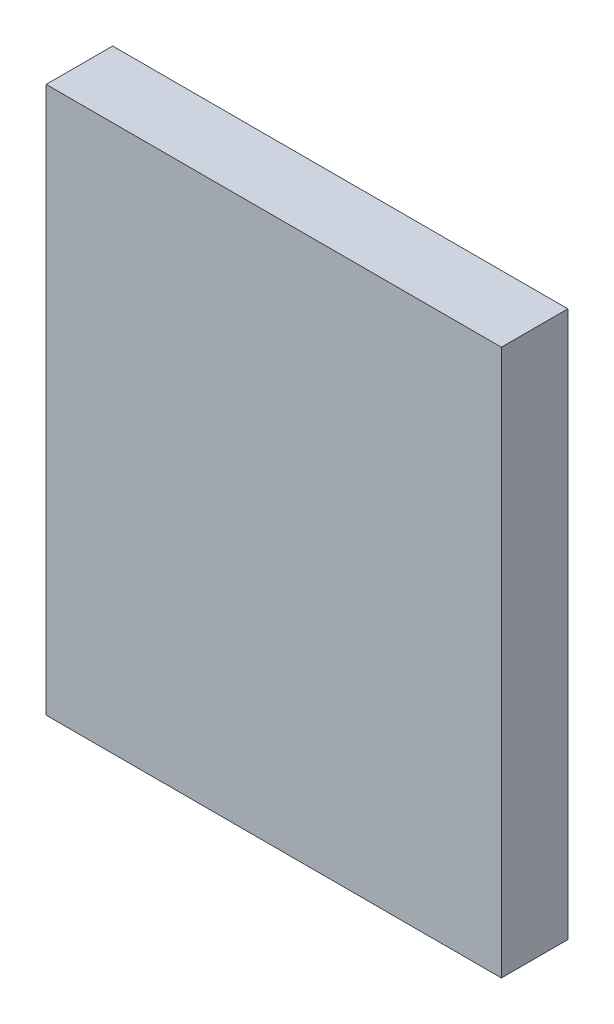
ISO-10303-21;
HEADER;
FILE_DESCRIPTION(('STEP AP214'),'2;1');
FILE_NAME('part.step','',(''),(''),'','','');
FILE_SCHEMA(('AUTOMOTIVE_DESIGN { 1 0 10303 214 1 1 1 1 }'));
ENDSEC;
DATA;
#1=APPLICATION_CONTEXT('core data for automotive mechanical design processes');
#2=APPLICATION_PROTOCOL_DEFINITION('international standard','automotive_design',2000,#1);
#3=PRODUCT_CONTEXT('',#1,'mechanical');
#4=PRODUCT('Part','Part','',(#3));
#5=PRODUCT_RELATED_PRODUCT_CATEGORY('part','',(#4));
#6=PRODUCT_DEFINITION_FORMATION('','',#4);
#7=PRODUCT_DEFINITION_CONTEXT('part definition',#1,'design');
#8=PRODUCT_DEFINITION('design','',#6,#7);
#9=PRODUCT_DEFINITION_SHAPE('','',#8);
#10=(LENGTH_UNIT() NAMED_UNIT(*) SI_UNIT(.MILLI.,.METRE.));
#11=(NAMED_UNIT(*) PLANE_ANGLE_UNIT() SI_UNIT($,.RADIAN.));
#12=(NAMED_UNIT(*) SI_UNIT($,.STERADIAN.) SOLID_ANGLE_UNIT());
#13=UNCERTAINTY_MEASURE_WITH_UNIT(LENGTH_MEASURE(1.E-05),#10,'distance_accuracy_value','');
#14=(GEOMETRIC_REPRESENTATION_CONTEXT(3) GLOBAL_UNCERTAINTY_ASSIGNED_CONTEXT((#13)) GLOBAL_UNIT_ASSIGNED_CONTEXT((#10,
#11,#12)) REPRESENTATION_CONTEXT('',''));
#15=CARTESIAN_POINT('',(0.,0.,0.));
#16=DIRECTION('',(0.,0.,1.));
#17=DIRECTION('',(1.,0.,0.));
#18=AXIS2_PLACEMENT_3D('',#15,#16,#17);
#19=CARTESIAN_POINT('',(25.,-30.,7.3));
#20=DIRECTION('',(-1.,0.,0.));
#21=DIRECTION('',(0.,0.,1.));
#22=AXIS2_PLACEMENT_3D('',#19,#20,#21);
#23=PLANE('',#22);
#24=DIRECTION('',(0.,1.,0.));
#25=VECTOR('',#24,1.);
#26=CARTESIAN_POINT('',(25.,-30.,0.));
#27=LINE('',#26,#25);
#28=CARTESIAN_POINT('',(25.,-30.,0.));
#29=VERTEX_POINT('',#28);
#30=CARTESIAN_POINT('',(25.,30.,0.));
#31=VERTEX_POINT('',#30);
#32=EDGE_CURVE('E113',#29,#31,#27,.T.);
#33=ORIENTED_EDGE('',*,*,#32,.T.);
#34=DIRECTION('',(0.,0.,-1.));
#35=VECTOR('',#34,1.);
#36=CARTESIAN_POINT('',(25.,30.,7.3));
#37=LINE('',#36,#35);
#38=CARTESIAN_POINT('',(25.,30.,7.3));
#39=VERTEX_POINT('',#38);
#40=EDGE_CURVE('E11',#39,#31,#37,.T.);
#41=ORIENTED_EDGE('',*,*,#40,.F.);
#42=DIRECTION('',(0.,1.,0.));
#43=VECTOR('',#42,1.);
#44=CARTESIAN_POINT('',(25.,-30.,7.3));
#45=LINE('',#44,#43);
#46=CARTESIAN_POINT('',(25.,-30.,7.3));
#47=VERTEX_POINT('',#46);
#48=EDGE_CURVE('E97',#47,#39,#45,.T.);
#49=ORIENTED_EDGE('',*,*,#48,.F.);
#50=DIRECTION('',(0.,0.,-1.));
#51=VECTOR('',#50,1.);
#52=CARTESIAN_POINT('',(25.,-30.,7.3));
#53=LINE('',#52,#51);
#54=EDGE_CURVE('E109',#47,#29,#53,.T.);
#55=ORIENTED_EDGE('',*,*,#54,.T.);
#56=EDGE_LOOP('',(#33,#41,#49,#55));
#57=FACE_BOUND('',#56,.T.);
#58=ADVANCED_FACE('F45',(#57),#23,.F.);
#59=CARTESIAN_POINT('',(-25.,30.,7.3));
#60=DIRECTION('',(0.,-1.,0.));
#61=DIRECTION('',(0.,0.,-1.));
#62=AXIS2_PLACEMENT_3D('',#59,#60,#61);
#63=PLANE('',#62);
#64=DIRECTION('',(-1.,0.,0.));
#65=VECTOR('',#64,1.);
#66=CARTESIAN_POINT('',(-25.,30.,0.));
#67=LINE('',#66,#65);
#68=CARTESIAN_POINT('',(-25.,30.,0.));
#69=VERTEX_POINT('',#68);
#70=EDGE_CURVE('E102',#31,#69,#67,.T.);
#71=ORIENTED_EDGE('',*,*,#70,.T.);
#72=DIRECTION('',(0.,0.,-1.));
#73=VECTOR('',#72,1.);
#74=CARTESIAN_POINT('',(-25.,30.,7.3));
#75=LINE('',#74,#73);
#76=CARTESIAN_POINT('',(-25.,30.,7.3));
#77=VERTEX_POINT('',#76);
#78=EDGE_CURVE('E54',#77,#69,#75,.T.);
#79=ORIENTED_EDGE('',*,*,#78,.F.);
#80=DIRECTION('',(-1.,0.,0.));
#81=VECTOR('',#80,1.);
#82=CARTESIAN_POINT('',(-25.,30.,7.3));
#83=LINE('',#82,#81);
#84=EDGE_CURVE('E92',#39,#77,#83,.T.);
#85=ORIENTED_EDGE('',*,*,#84,.F.);
#86=ORIENTED_EDGE('',*,*,#40,.T.);
#87=EDGE_LOOP('',(#71,#79,#85,#86));
#88=FACE_BOUND('',#87,.T.);
#89=ADVANCED_FACE('F101',(#88),#63,.F.);
#90=CARTESIAN_POINT('',(-25.,-30.,7.3));
#91=DIRECTION('',(1.,0.,0.));
#92=DIRECTION('',(0.,0.,-1.));
#93=AXIS2_PLACEMENT_3D('',#90,#91,#92);
#94=PLANE('',#93);
#95=DIRECTION('',(0.,-1.,0.));
#96=VECTOR('',#95,1.);
#97=CARTESIAN_POINT('',(-25.,-30.,0.));
#98=LINE('',#97,#96);
#99=CARTESIAN_POINT('',(-25.,-30.,0.));
#100=VERTEX_POINT('',#99);
#101=EDGE_CURVE('E79',#69,#100,#98,.T.);
#102=ORIENTED_EDGE('',*,*,#101,.T.);
#103=DIRECTION('',(0.,0.,-1.));
#104=VECTOR('',#103,1.);
#105=CARTESIAN_POINT('',(-25.,-30.,7.3));
#106=LINE('',#105,#104);
#107=CARTESIAN_POINT('',(-25.,-30.,7.3));
#108=VERTEX_POINT('',#107);
#109=EDGE_CURVE('E104',#108,#100,#106,.T.);
#110=ORIENTED_EDGE('',*,*,#109,.F.);
#111=DIRECTION('',(0.,-1.,0.));
#112=VECTOR('',#111,1.);
#113=CARTESIAN_POINT('',(-25.,-30.,7.3));
#114=LINE('',#113,#112);
#115=EDGE_CURVE('E95',#77,#108,#114,.T.);
#116=ORIENTED_EDGE('',*,*,#115,.F.);
#117=ORIENTED_EDGE('',*,*,#78,.T.);
#118=EDGE_LOOP('',(#102,#110,#116,#117));
#119=FACE_BOUND('',#118,.T.);
#120=ADVANCED_FACE('F105',(#119),#94,.F.);
#121=CARTESIAN_POINT('',(-25.,-30.,7.3));
#122=DIRECTION('',(0.,1.,0.));
#123=DIRECTION('',(0.,0.,1.));
#124=AXIS2_PLACEMENT_3D('',#121,#122,#123);
#125=PLANE('',#124);
#126=DIRECTION('',(1.,0.,0.));
#127=VECTOR('',#126,1.);
#128=CARTESIAN_POINT('',(-25.,-30.,0.));
#129=LINE('',#128,#127);
#130=EDGE_CURVE('E85',#100,#29,#129,.T.);
#131=ORIENTED_EDGE('',*,*,#130,.T.);
#132=ORIENTED_EDGE('',*,*,#54,.F.);
#133=DIRECTION('',(1.,0.,0.));
#134=VECTOR('',#133,1.);
#135=CARTESIAN_POINT('',(-25.,-30.,7.3));
#136=LINE('',#135,#134);
#137=EDGE_CURVE('E62',#108,#47,#136,.T.);
#138=ORIENTED_EDGE('',*,*,#137,.F.);
#139=ORIENTED_EDGE('',*,*,#109,.T.);
#140=EDGE_LOOP('',(#131,#132,#138,#139));
#141=FACE_BOUND('',#140,.T.);
#142=ADVANCED_FACE('F126',(#141),#125,.F.);
#143=CARTESIAN_POINT('',(0.,0.,7.3));
#144=DIRECTION('',(0.,0.,-1.));
#145=DIRECTION('',(-1.,0.,0.));
#146=AXIS2_PLACEMENT_3D('',#143,#144,#145);
#147=PLANE('',#146);
#148=ORIENTED_EDGE('',*,*,#48,.T.);
#149=ORIENTED_EDGE('',*,*,#84,.T.);
#150=ORIENTED_EDGE('',*,*,#115,.T.);
#151=ORIENTED_EDGE('',*,*,#137,.T.);
#152=EDGE_LOOP('',(#148,#149,#150,#151));
#153=FACE_BOUND('',#152,.T.);
#154=ADVANCED_FACE('F93',(#153),#147,.F.);
#155=CARTESIAN_POINT('',(0.,0.,0.));
#156=DIRECTION('',(0.,0.,-1.));
#157=DIRECTION('',(-1.,0.,0.));
#158=AXIS2_PLACEMENT_3D('',#155,#156,#157);
#159=PLANE('',#158);
#160=ORIENTED_EDGE('',*,*,#32,.F.);
#161=ORIENTED_EDGE('',*,*,#130,.F.);
#162=ORIENTED_EDGE('',*,*,#101,.F.);
#163=ORIENTED_EDGE('',*,*,#70,.F.);
#164=EDGE_LOOP('',(#160,#161,#162,#163));
#165=FACE_BOUND('',#164,.T.);
#166=ADVANCED_FACE('F129',(#165),#159,.T.);
#167=CLOSED_SHELL('',(#58,#89,#120,#142,#154,#166));
#168=MANIFOLD_SOLID_BREP('B2',#167);
#169=ADVANCED_BREP_SHAPE_REPRESENTATION('',(#18,#168),#14);
#170=SHAPE_DEFINITION_REPRESENTATION(#9,#169);
ENDSEC;
END-ISO-10303-21;
